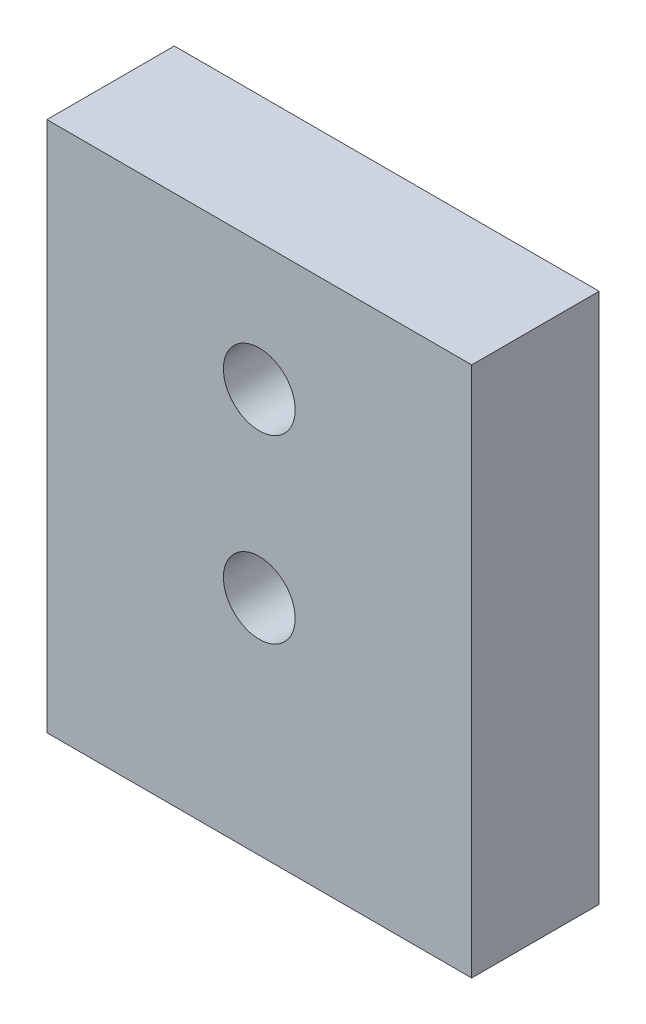
ISO-10303-21;
HEADER;
FILE_DESCRIPTION(('STEP AP214'),'2;1');
FILE_NAME('part.step','',(''),(''),'','','');
FILE_SCHEMA(('AUTOMOTIVE_DESIGN { 1 0 10303 214 1 1 1 1 }'));
ENDSEC;
DATA;
#1=APPLICATION_CONTEXT('core data for automotive mechanical design processes');
#2=APPLICATION_PROTOCOL_DEFINITION('international standard','automotive_design',2000,#1);
#3=PRODUCT_CONTEXT('',#1,'mechanical');
#4=PRODUCT('Part','Part','',(#3));
#5=PRODUCT_RELATED_PRODUCT_CATEGORY('part','',(#4));
#6=PRODUCT_DEFINITION_FORMATION('','',#4);
#7=PRODUCT_DEFINITION_CONTEXT('part definition',#1,'design');
#8=PRODUCT_DEFINITION('design','',#6,#7);
#9=PRODUCT_DEFINITION_SHAPE('','',#8);
#10=(LENGTH_UNIT() NAMED_UNIT(*) SI_UNIT(.MILLI.,.METRE.));
#11=(NAMED_UNIT(*) PLANE_ANGLE_UNIT() SI_UNIT($,.RADIAN.));
#12=(NAMED_UNIT(*) SI_UNIT($,.STERADIAN.) SOLID_ANGLE_UNIT());
#13=UNCERTAINTY_MEASURE_WITH_UNIT(LENGTH_MEASURE(1.E-05),#10,'distance_accuracy_value','');
#14=(GEOMETRIC_REPRESENTATION_CONTEXT(3) GLOBAL_UNCERTAINTY_ASSIGNED_CONTEXT((#13)) GLOBAL_UNIT_ASSIGNED_CONTEXT((#10,
#11,#12)) REPRESENTATION_CONTEXT('',''));
#15=CARTESIAN_POINT('',(0.,0.,0.));
#16=DIRECTION('',(0.,0.,1.));
#17=DIRECTION('',(1.,0.,0.));
#18=AXIS2_PLACEMENT_3D('',#15,#16,#17);
#19=CARTESIAN_POINT('',(0.,0.,-12.));
#20=DIRECTION('',(0.,0.,1.));
#21=DIRECTION('',(-1.,0.,0.));
#22=AXIS2_PLACEMENT_3D('',#19,#20,#21);
#23=PLANE('',#22);
#24=CARTESIAN_POINT('',(0.,21.,-12.));
#25=DIRECTION('',(0.,0.,1.));
#26=DIRECTION('',(1.,0.,0.));
#27=AXIS2_PLACEMENT_3D('',#24,#25,#26);
#28=CIRCLE('',#27,5.55625);
#29=CARTESIAN_POINT('',(5.55625,21.,-12.));
#30=VERTEX_POINT('',#29);
#31=EDGE_CURVE('E135',#30,#30,#28,.T.);
#32=ORIENTED_EDGE('',*,*,#31,.T.);
#33=EDGE_LOOP('',(#32));
#34=FACE_BOUND('',#33,.T.);
#35=DIRECTION('',(0.,-1.,0.));
#36=VECTOR('',#35,1.);
#37=CARTESIAN_POINT('',(-20.,0.,-12.));
#38=LINE('',#37,#36);
#39=CARTESIAN_POINT('',(-20.,50.,-12.));
#40=VERTEX_POINT('',#39);
#41=CARTESIAN_POINT('',(-20.,0.,-12.));
#42=VERTEX_POINT('',#41);
#43=EDGE_CURVE('E148',#40,#42,#38,.T.);
#44=ORIENTED_EDGE('',*,*,#43,.F.);
#45=DIRECTION('',(-1.,0.,0.));
#46=VECTOR('',#45,1.);
#47=CARTESIAN_POINT('',(-20.,50.,-12.));
#48=LINE('',#47,#46);
#49=CARTESIAN_POINT('',(20.,50.,-12.));
#50=VERTEX_POINT('',#49);
#51=EDGE_CURVE('E155',#50,#40,#48,.T.);
#52=ORIENTED_EDGE('',*,*,#51,.F.);
#53=DIRECTION('',(0.,1.,0.));
#54=VECTOR('',#53,1.);
#55=CARTESIAN_POINT('',(20.,0.,-12.));
#56=LINE('',#55,#54);
#57=CARTESIAN_POINT('',(20.,0.,-12.));
#58=VERTEX_POINT('',#57);
#59=EDGE_CURVE('E152',#58,#50,#56,.T.);
#60=ORIENTED_EDGE('',*,*,#59,.F.);
#61=DIRECTION('',(1.,0.,0.));
#62=VECTOR('',#61,1.);
#63=CARTESIAN_POINT('',(20.,0.,-12.));
#64=LINE('',#63,#62);
#65=EDGE_CURVE('E150',#42,#58,#64,.T.);
#66=ORIENTED_EDGE('',*,*,#65,.F.);
#67=EDGE_LOOP('',(#44,#52,#60,#66));
#68=FACE_BOUND('',#67,.T.);
#69=CARTESIAN_POINT('',(0.,38.,-12.));
#70=DIRECTION('',(0.,0.,1.));
#71=DIRECTION('',(1.,0.,0.));
#72=AXIS2_PLACEMENT_3D('',#69,#70,#71);
#73=CIRCLE('',#72,5.55625);
#74=CARTESIAN_POINT('',(5.55625,38.,-12.));
#75=VERTEX_POINT('',#74);
#76=EDGE_CURVE('E123',#75,#75,#73,.T.);
#77=ORIENTED_EDGE('',*,*,#76,.T.);
#78=EDGE_LOOP('',(#77));
#79=FACE_BOUND('',#78,.T.);
#80=ADVANCED_FACE('F41',(#34,#68,#79),#23,.F.);
#81=CARTESIAN_POINT('',(-20.,0.,-12.));
#82=DIRECTION('',(1.,0.,0.));
#83=DIRECTION('',(0.,1.,0.));
#84=AXIS2_PLACEMENT_3D('',#81,#82,#83);
#85=PLANE('',#84);
#86=DIRECTION('',(0.,-1.,0.));
#87=VECTOR('',#86,1.);
#88=CARTESIAN_POINT('',(-20.,0.,0.));
#89=LINE('',#88,#87);
#90=CARTESIAN_POINT('',(-20.,50.,0.));
#91=VERTEX_POINT('',#90);
#92=CARTESIAN_POINT('',(-20.,0.,0.));
#93=VERTEX_POINT('',#92);
#94=EDGE_CURVE('E147',#91,#93,#89,.T.);
#95=ORIENTED_EDGE('',*,*,#94,.F.);
#96=DIRECTION('',(0.,0.,1.));
#97=VECTOR('',#96,1.);
#98=CARTESIAN_POINT('',(-20.,50.,-12.));
#99=LINE('',#98,#97);
#100=EDGE_CURVE('E58',#40,#91,#99,.T.);
#101=ORIENTED_EDGE('',*,*,#100,.F.);
#102=ORIENTED_EDGE('',*,*,#43,.T.);
#103=DIRECTION('',(0.,0.,1.));
#104=VECTOR('',#103,1.);
#105=CARTESIAN_POINT('',(-20.,0.,-12.));
#106=LINE('',#105,#104);
#107=EDGE_CURVE('E11',#42,#93,#106,.T.);
#108=ORIENTED_EDGE('',*,*,#107,.T.);
#109=EDGE_LOOP('',(#95,#101,#102,#108));
#110=FACE_BOUND('',#109,.T.);
#111=ADVANCED_FACE('F43',(#110),#85,.F.);
#112=CARTESIAN_POINT('',(20.,0.,-12.));
#113=DIRECTION('',(0.,1.,0.));
#114=DIRECTION('',(-1.,0.,0.));
#115=AXIS2_PLACEMENT_3D('',#112,#113,#114);
#116=PLANE('',#115);
#117=CARTESIAN_POINT('',(-14.,0.,-6.00000000000001));
#118=DIRECTION('',(0.,1.,0.));
#119=DIRECTION('',(0.,0.,1.));
#120=AXIS2_PLACEMENT_3D('',#117,#118,#119);
#121=CIRCLE('',#120,1.7272);
#122=CARTESIAN_POINT('',(-14.,0.,-4.27280000000001));
#123=VERTEX_POINT('',#122);
#124=EDGE_CURVE('E107',#123,#123,#121,.T.);
#125=ORIENTED_EDGE('',*,*,#124,.T.);
#126=EDGE_LOOP('',(#125));
#127=FACE_BOUND('',#126,.T.);
#128=CARTESIAN_POINT('',(14.,0.,-6.00000000000001));
#129=DIRECTION('',(0.,1.,0.));
#130=DIRECTION('',(0.,0.,1.));
#131=AXIS2_PLACEMENT_3D('',#128,#129,#130);
#132=CIRCLE('',#131,1.7272);
#133=CARTESIAN_POINT('',(14.,0.,-4.27280000000001));
#134=VERTEX_POINT('',#133);
#135=EDGE_CURVE('E106',#134,#134,#132,.T.);
#136=ORIENTED_EDGE('',*,*,#135,.T.);
#137=EDGE_LOOP('',(#136));
#138=FACE_BOUND('',#137,.T.);
#139=CARTESIAN_POINT('',(0.,0.,-6.00000000000001));
#140=DIRECTION('',(0.,1.,0.));
#141=DIRECTION('',(0.,0.,1.));
#142=AXIS2_PLACEMENT_3D('',#139,#140,#141);
#143=CIRCLE('',#142,1.7272);
#144=CARTESIAN_POINT('',(0.,0.,-4.27280000000001));
#145=VERTEX_POINT('',#144);
#146=EDGE_CURVE('E117',#145,#145,#143,.T.);
#147=ORIENTED_EDGE('',*,*,#146,.T.);
#148=EDGE_LOOP('',(#147));
#149=FACE_BOUND('',#148,.T.);
#150=DIRECTION('',(1.,0.,0.));
#151=VECTOR('',#150,1.);
#152=CARTESIAN_POINT('',(20.,0.,0.));
#153=LINE('',#152,#151);
#154=CARTESIAN_POINT('',(20.,0.,0.));
#155=VERTEX_POINT('',#154);
#156=EDGE_CURVE('E158',#93,#155,#153,.T.);
#157=ORIENTED_EDGE('',*,*,#156,.F.);
#158=ORIENTED_EDGE('',*,*,#107,.F.);
#159=ORIENTED_EDGE('',*,*,#65,.T.);
#160=DIRECTION('',(0.,0.,1.));
#161=VECTOR('',#160,1.);
#162=CARTESIAN_POINT('',(20.,0.,-12.));
#163=LINE('',#162,#161);
#164=EDGE_CURVE('E50',#58,#155,#163,.T.);
#165=ORIENTED_EDGE('',*,*,#164,.T.);
#166=EDGE_LOOP('',(#157,#158,#159,#165));
#167=FACE_BOUND('',#166,.T.);
#168=ADVANCED_FACE('F167',(#127,#138,#149,#167),#116,.F.);
#169=CARTESIAN_POINT('',(20.,0.,-12.));
#170=DIRECTION('',(-1.,0.,0.));
#171=DIRECTION('',(0.,0.,-1.));
#172=AXIS2_PLACEMENT_3D('',#169,#170,#171);
#173=PLANE('',#172);
#174=DIRECTION('',(0.,1.,0.));
#175=VECTOR('',#174,1.);
#176=CARTESIAN_POINT('',(20.,0.,0.));
#177=LINE('',#176,#175);
#178=CARTESIAN_POINT('',(20.,50.,0.));
#179=VERTEX_POINT('',#178);
#180=EDGE_CURVE('E161',#155,#179,#177,.T.);
#181=ORIENTED_EDGE('',*,*,#180,.F.);
#182=ORIENTED_EDGE('',*,*,#164,.F.);
#183=ORIENTED_EDGE('',*,*,#59,.T.);
#184=DIRECTION('',(0.,0.,1.));
#185=VECTOR('',#184,1.);
#186=CARTESIAN_POINT('',(20.,50.,-12.));
#187=LINE('',#186,#185);
#188=EDGE_CURVE('E165',#50,#179,#187,.T.);
#189=ORIENTED_EDGE('',*,*,#188,.T.);
#190=EDGE_LOOP('',(#181,#182,#183,#189));
#191=FACE_BOUND('',#190,.T.);
#192=ADVANCED_FACE('F175',(#191),#173,.F.);
#193=CARTESIAN_POINT('',(-20.,50.,-12.));
#194=DIRECTION('',(0.,-1.,0.));
#195=DIRECTION('',(1.,0.,0.));
#196=AXIS2_PLACEMENT_3D('',#193,#194,#195);
#197=PLANE('',#196);
#198=DIRECTION('',(-1.,0.,0.));
#199=VECTOR('',#198,1.);
#200=CARTESIAN_POINT('',(-20.,50.,0.));
#201=LINE('',#200,#199);
#202=EDGE_CURVE('E75',#179,#91,#201,.T.);
#203=ORIENTED_EDGE('',*,*,#202,.F.);
#204=ORIENTED_EDGE('',*,*,#188,.F.);
#205=ORIENTED_EDGE('',*,*,#51,.T.);
#206=ORIENTED_EDGE('',*,*,#100,.T.);
#207=EDGE_LOOP('',(#203,#204,#205,#206));
#208=FACE_BOUND('',#207,.T.);
#209=ADVANCED_FACE('F176',(#208),#197,.F.);
#210=CARTESIAN_POINT('',(0.,0.,0.));
#211=DIRECTION('',(0.,0.,1.));
#212=DIRECTION('',(-1.,0.,0.));
#213=AXIS2_PLACEMENT_3D('',#210,#211,#212);
#214=PLANE('',#213);
#215=CARTESIAN_POINT('',(0.,38.,0.));
#216=DIRECTION('',(0.,0.,1.));
#217=DIRECTION('',(1.,0.,0.));
#218=AXIS2_PLACEMENT_3D('',#215,#216,#217);
#219=CIRCLE('',#218,3.3782);
#220=CARTESIAN_POINT('',(3.3782,38.,0.));
#221=VERTEX_POINT('',#220);
#222=EDGE_CURVE('E132',#221,#221,#219,.T.);
#223=ORIENTED_EDGE('',*,*,#222,.F.);
#224=EDGE_LOOP('',(#223));
#225=FACE_BOUND('',#224,.T.);
#226=CARTESIAN_POINT('',(0.,21.,0.));
#227=DIRECTION('',(0.,0.,1.));
#228=DIRECTION('',(1.,0.,0.));
#229=AXIS2_PLACEMENT_3D('',#226,#227,#228);
#230=CIRCLE('',#229,3.3782);
#231=CARTESIAN_POINT('',(3.3782,21.,0.));
#232=VERTEX_POINT('',#231);
#233=EDGE_CURVE('E144',#232,#232,#230,.T.);
#234=ORIENTED_EDGE('',*,*,#233,.F.);
#235=EDGE_LOOP('',(#234));
#236=FACE_BOUND('',#235,.T.);
#237=ORIENTED_EDGE('',*,*,#94,.T.);
#238=ORIENTED_EDGE('',*,*,#156,.T.);
#239=ORIENTED_EDGE('',*,*,#180,.T.);
#240=ORIENTED_EDGE('',*,*,#202,.T.);
#241=EDGE_LOOP('',(#237,#238,#239,#240));
#242=FACE_BOUND('',#241,.T.);
#243=ADVANCED_FACE('F170',(#225,#236,#242),#214,.T.);
#244=CARTESIAN_POINT('',(0.,21.,-12.));
#245=DIRECTION('',(0.,0.,-1.));
#246=DIRECTION('',(1.,0.,0.));
#247=AXIS2_PLACEMENT_3D('',#244,#245,#246);
#248=CYLINDRICAL_SURFACE('',#247,3.3782);
#249=ORIENTED_EDGE('',*,*,#233,.T.);
#250=EDGE_LOOP('',(#249));
#251=FACE_BOUND('',#250,.T.);
#252=CARTESIAN_POINT('',(0.,21.,-5.65));
#253=DIRECTION('',(0.,0.,1.));
#254=DIRECTION('',(1.,0.,0.));
#255=AXIS2_PLACEMENT_3D('',#252,#253,#254);
#256=CIRCLE('',#255,3.3782);
#257=CARTESIAN_POINT('',(3.3782,21.,-5.65));
#258=VERTEX_POINT('',#257);
#259=EDGE_CURVE('E141',#258,#258,#256,.T.);
#260=ORIENTED_EDGE('',*,*,#259,.F.);
#261=EDGE_LOOP('',(#260));
#262=FACE_BOUND('',#261,.T.);
#263=ADVANCED_FACE('F183',(#251,#262),#248,.F.);
#264=CARTESIAN_POINT('',(3.3782,21.,-5.65));
#265=DIRECTION('',(0.,0.,1.));
#266=DIRECTION('',(-1.,0.,0.));
#267=AXIS2_PLACEMENT_3D('',#264,#265,#266);
#268=PLANE('',#267);
#269=ORIENTED_EDGE('',*,*,#259,.T.);
#270=EDGE_LOOP('',(#269));
#271=FACE_BOUND('',#270,.T.);
#272=CARTESIAN_POINT('',(0.,21.,-5.65));
#273=DIRECTION('',(0.,0.,1.));
#274=DIRECTION('',(1.,0.,0.));
#275=AXIS2_PLACEMENT_3D('',#272,#273,#274);
#276=CIRCLE('',#275,5.55625);
#277=CARTESIAN_POINT('',(5.55625,21.,-5.65));
#278=VERTEX_POINT('',#277);
#279=EDGE_CURVE('E138',#278,#278,#276,.T.);
#280=ORIENTED_EDGE('',*,*,#279,.F.);
#281=EDGE_LOOP('',(#280));
#282=FACE_BOUND('',#281,.T.);
#283=ADVANCED_FACE('F196',(#271,#282),#268,.F.);
#284=CARTESIAN_POINT('',(0.,21.,-12.));
#285=DIRECTION('',(0.,0.,-1.));
#286=DIRECTION('',(1.,0.,0.));
#287=AXIS2_PLACEMENT_3D('',#284,#285,#286);
#288=CYLINDRICAL_SURFACE('',#287,5.55625);
#289=ORIENTED_EDGE('',*,*,#279,.T.);
#290=EDGE_LOOP('',(#289));
#291=FACE_BOUND('',#290,.T.);
#292=ORIENTED_EDGE('',*,*,#31,.F.);
#293=EDGE_LOOP('',(#292));
#294=FACE_BOUND('',#293,.T.);
#295=ADVANCED_FACE('F200',(#291,#294),#288,.F.);
#296=CARTESIAN_POINT('',(0.,38.,-12.));
#297=DIRECTION('',(0.,0.,-1.));
#298=DIRECTION('',(1.,0.,0.));
#299=AXIS2_PLACEMENT_3D('',#296,#297,#298);
#300=CYLINDRICAL_SURFACE('',#299,3.3782);
#301=ORIENTED_EDGE('',*,*,#222,.T.);
#302=EDGE_LOOP('',(#301));
#303=FACE_BOUND('',#302,.T.);
#304=CARTESIAN_POINT('',(0.,38.,-5.65));
#305=DIRECTION('',(0.,0.,1.));
#306=DIRECTION('',(1.,0.,0.));
#307=AXIS2_PLACEMENT_3D('',#304,#305,#306);
#308=CIRCLE('',#307,3.3782);
#309=CARTESIAN_POINT('',(3.3782,38.,-5.65));
#310=VERTEX_POINT('',#309);
#311=EDGE_CURVE('E129',#310,#310,#308,.T.);
#312=ORIENTED_EDGE('',*,*,#311,.F.);
#313=EDGE_LOOP('',(#312));
#314=FACE_BOUND('',#313,.T.);
#315=ADVANCED_FACE('F204',(#303,#314),#300,.F.);
#316=CARTESIAN_POINT('',(3.3782,38.,-5.65));
#317=DIRECTION('',(0.,0.,1.));
#318=DIRECTION('',(-1.,0.,0.));
#319=AXIS2_PLACEMENT_3D('',#316,#317,#318);
#320=PLANE('',#319);
#321=ORIENTED_EDGE('',*,*,#311,.T.);
#322=EDGE_LOOP('',(#321));
#323=FACE_BOUND('',#322,.T.);
#324=CARTESIAN_POINT('',(0.,38.,-5.65));
#325=DIRECTION('',(0.,0.,1.));
#326=DIRECTION('',(1.,0.,0.));
#327=AXIS2_PLACEMENT_3D('',#324,#325,#326);
#328=CIRCLE('',#327,5.55625);
#329=CARTESIAN_POINT('',(5.55625,38.,-5.65));
#330=VERTEX_POINT('',#329);
#331=EDGE_CURVE('E126',#330,#330,#328,.T.);
#332=ORIENTED_EDGE('',*,*,#331,.F.);
#333=EDGE_LOOP('',(#332));
#334=FACE_BOUND('',#333,.T.);
#335=ADVANCED_FACE('F208',(#323,#334),#320,.F.);
#336=CARTESIAN_POINT('',(0.,38.,-12.));
#337=DIRECTION('',(0.,0.,-1.));
#338=DIRECTION('',(1.,0.,0.));
#339=AXIS2_PLACEMENT_3D('',#336,#337,#338);
#340=CYLINDRICAL_SURFACE('',#339,5.55625);
#341=ORIENTED_EDGE('',*,*,#331,.T.);
#342=EDGE_LOOP('',(#341));
#343=FACE_BOUND('',#342,.T.);
#344=ORIENTED_EDGE('',*,*,#76,.F.);
#345=EDGE_LOOP('',(#344));
#346=FACE_BOUND('',#345,.T.);
#347=ADVANCED_FACE('F212',(#343,#346),#340,.F.);
#348=CARTESIAN_POINT('',(0.,12.7,-6.00000000000001));
#349=DIRECTION('',(0.,-1.,0.));
#350=DIRECTION('',(0.,0.,1.));
#351=AXIS2_PLACEMENT_3D('',#348,#349,#350);
#352=CONICAL_SURFACE('',#351,1.7272,1.02974425867665);
#353=CARTESIAN_POINT('',(0.,13.7378064611844,-6.00000000000001));
#354=VERTEX_POINT('',#353);
#355=VERTEX_LOOP('',#354);
#356=FACE_BOUND('',#355,.T.);
#357=CARTESIAN_POINT('',(0.,12.7,-6.00000000000001));
#358=DIRECTION('',(0.,1.,0.));
#359=DIRECTION('',(0.,0.,1.));
#360=AXIS2_PLACEMENT_3D('',#357,#358,#359);
#361=CIRCLE('',#360,1.7272);
#362=CARTESIAN_POINT('',(0.,12.7,-4.27280000000001));
#363=VERTEX_POINT('',#362);
#364=EDGE_CURVE('E120',#363,#363,#361,.T.);
#365=ORIENTED_EDGE('',*,*,#364,.F.);
#366=EDGE_LOOP('',(#365));
#367=FACE_BOUND('',#366,.T.);
#368=ADVANCED_FACE('F216',(#356,#367),#352,.F.);
#369=CARTESIAN_POINT('',(0.,0.,-6.00000000000001));
#370=DIRECTION('',(0.,-1.,0.));
#371=DIRECTION('',(0.,0.,1.));
#372=AXIS2_PLACEMENT_3D('',#369,#370,#371);
#373=CYLINDRICAL_SURFACE('',#372,1.7272);
#374=ORIENTED_EDGE('',*,*,#364,.T.);
#375=EDGE_LOOP('',(#374));
#376=FACE_BOUND('',#375,.T.);
#377=ORIENTED_EDGE('',*,*,#146,.F.);
#378=EDGE_LOOP('',(#377));
#379=FACE_BOUND('',#378,.T.);
#380=ADVANCED_FACE('F220',(#376,#379),#373,.F.);
#381=CARTESIAN_POINT('',(14.,12.7,-6.00000000000001));
#382=DIRECTION('',(0.,-1.,0.));
#383=DIRECTION('',(0.,0.,1.));
#384=AXIS2_PLACEMENT_3D('',#381,#382,#383);
#385=CONICAL_SURFACE('',#384,1.7272,1.02974425867665);
#386=CARTESIAN_POINT('',(14.,13.7378064611844,-6.00000000000001));
#387=VERTEX_POINT('',#386);
#388=VERTEX_LOOP('',#387);
#389=FACE_BOUND('',#388,.T.);
#390=CARTESIAN_POINT('',(14.,12.7,-6.00000000000001));
#391=DIRECTION('',(0.,1.,0.));
#392=DIRECTION('',(0.,0.,1.));
#393=AXIS2_PLACEMENT_3D('',#390,#391,#392);
#394=CIRCLE('',#393,1.7272);
#395=CARTESIAN_POINT('',(14.,12.7,-4.27280000000001));
#396=VERTEX_POINT('',#395);
#397=EDGE_CURVE('E110',#396,#396,#394,.T.);
#398=ORIENTED_EDGE('',*,*,#397,.F.);
#399=EDGE_LOOP('',(#398));
#400=FACE_BOUND('',#399,.T.);
#401=ADVANCED_FACE('F224',(#389,#400),#385,.F.);
#402=CARTESIAN_POINT('',(14.,0.,-6.00000000000001));
#403=DIRECTION('',(0.,-1.,0.));
#404=DIRECTION('',(0.,0.,1.));
#405=AXIS2_PLACEMENT_3D('',#402,#403,#404);
#406=CYLINDRICAL_SURFACE('',#405,1.7272);
#407=ORIENTED_EDGE('',*,*,#397,.T.);
#408=EDGE_LOOP('',(#407));
#409=FACE_BOUND('',#408,.T.);
#410=ORIENTED_EDGE('',*,*,#135,.F.);
#411=EDGE_LOOP('',(#410));
#412=FACE_BOUND('',#411,.T.);
#413=ADVANCED_FACE('F100',(#409,#412),#406,.F.);
#414=CARTESIAN_POINT('',(-14.,12.7,-6.00000000000001));
#415=DIRECTION('',(0.,-1.,0.));
#416=DIRECTION('',(0.,0.,1.));
#417=AXIS2_PLACEMENT_3D('',#414,#415,#416);
#418=CONICAL_SURFACE('',#417,1.7272,1.02974425867665);
#419=CARTESIAN_POINT('',(-14.,13.7378064611844,-6.00000000000001));
#420=VERTEX_POINT('',#419);
#421=VERTEX_LOOP('',#420);
#422=FACE_BOUND('',#421,.T.);
#423=CARTESIAN_POINT('',(-14.,12.7,-6.00000000000001));
#424=DIRECTION('',(0.,1.,0.));
#425=DIRECTION('',(0.,0.,1.));
#426=AXIS2_PLACEMENT_3D('',#423,#424,#425);
#427=CIRCLE('',#426,1.7272);
#428=CARTESIAN_POINT('',(-14.,12.7,-4.27280000000001));
#429=VERTEX_POINT('',#428);
#430=EDGE_CURVE('E104',#429,#429,#427,.T.);
#431=ORIENTED_EDGE('',*,*,#430,.F.);
#432=EDGE_LOOP('',(#431));
#433=FACE_BOUND('',#432,.T.);
#434=ADVANCED_FACE('F96',(#422,#433),#418,.F.);
#435=CARTESIAN_POINT('',(-14.,0.,-6.00000000000001));
#436=DIRECTION('',(0.,-1.,0.));
#437=DIRECTION('',(0.,0.,1.));
#438=AXIS2_PLACEMENT_3D('',#435,#436,#437);
#439=CYLINDRICAL_SURFACE('',#438,1.7272);
#440=ORIENTED_EDGE('',*,*,#430,.T.);
#441=EDGE_LOOP('',(#440));
#442=FACE_BOUND('',#441,.T.);
#443=ORIENTED_EDGE('',*,*,#124,.F.);
#444=EDGE_LOOP('',(#443));
#445=FACE_BOUND('',#444,.T.);
#446=ADVANCED_FACE('F99',(#442,#445),#439,.F.);
#447=CLOSED_SHELL('',(#80,#111,#168,#192,#209,#243,#263,#283,#295,#315,#335,#347,#368,#380,#401,
#413,#434,#446));
#448=MANIFOLD_SOLID_BREP('B2',#447);
#449=ADVANCED_BREP_SHAPE_REPRESENTATION('',(#18,#448),#14);
#450=SHAPE_DEFINITION_REPRESENTATION(#9,#449);
ENDSEC;
END-ISO-10303-21;
